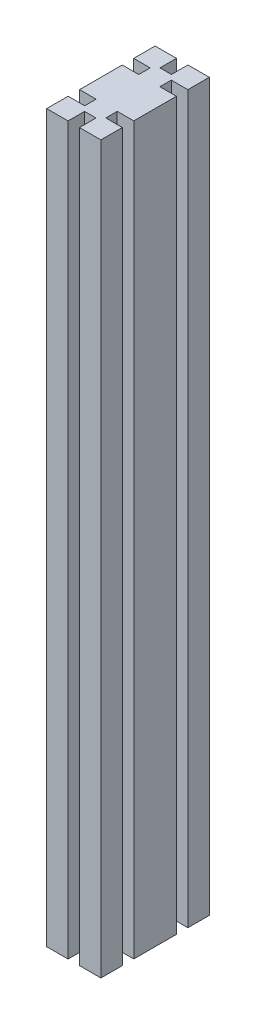
ISO-10303-21;
HEADER;
FILE_DESCRIPTION(('STEP AP214'),'2;1');
FILE_NAME('part.step','',(''),(''),'','','');
FILE_SCHEMA(('AUTOMOTIVE_DESIGN { 1 0 10303 214 1 1 1 1 }'));
ENDSEC;
DATA;
#1=APPLICATION_CONTEXT('core data for automotive mechanical design processes');
#2=APPLICATION_PROTOCOL_DEFINITION('international standard','automotive_design',2000,#1);
#3=PRODUCT_CONTEXT('',#1,'mechanical');
#4=PRODUCT('Part','Part','',(#3));
#5=PRODUCT_RELATED_PRODUCT_CATEGORY('part','',(#4));
#6=PRODUCT_DEFINITION_FORMATION('','',#4);
#7=PRODUCT_DEFINITION_CONTEXT('part definition',#1,'design');
#8=PRODUCT_DEFINITION('design','',#6,#7);
#9=PRODUCT_DEFINITION_SHAPE('','',#8);
#10=(LENGTH_UNIT() NAMED_UNIT(*) SI_UNIT(.MILLI.,.METRE.));
#11=(NAMED_UNIT(*) PLANE_ANGLE_UNIT() SI_UNIT($,.RADIAN.));
#12=(NAMED_UNIT(*) SI_UNIT($,.STERADIAN.) SOLID_ANGLE_UNIT());
#13=UNCERTAINTY_MEASURE_WITH_UNIT(LENGTH_MEASURE(1.E-05),#10,'distance_accuracy_value','');
#14=(GEOMETRIC_REPRESENTATION_CONTEXT(3) GLOBAL_UNCERTAINTY_ASSIGNED_CONTEXT((#13)) GLOBAL_UNIT_ASSIGNED_CONTEXT((#10,
#11,#12)) REPRESENTATION_CONTEXT('',''));
#15=CARTESIAN_POINT('',(0.,0.,0.));
#16=DIRECTION('',(0.,0.,1.));
#17=DIRECTION('',(1.,0.,0.));
#18=AXIS2_PLACEMENT_3D('',#15,#16,#17);
#19=CARTESIAN_POINT('',(18.95475,508.,0.));
#20=DIRECTION('',(-1.,0.,0.));
#21=DIRECTION('',(0.,0.,1.));
#22=AXIS2_PLACEMENT_3D('',#19,#20,#21);
#23=PLANE('',#22);
#24=DIRECTION('',(0.,0.,-1.));
#25=VECTOR('',#24,1.);
#26=CARTESIAN_POINT('',(18.95475,0.,0.));
#27=LINE('',#26,#25);
#28=CARTESIAN_POINT('',(18.95475,0.,37.94125));
#29=VERTEX_POINT('',#28);
#30=CARTESIAN_POINT('',(18.95475,0.,22.9362));
#31=VERTEX_POINT('',#30);
#32=EDGE_CURVE('E268',#29,#31,#27,.T.);
#33=ORIENTED_EDGE('',*,*,#32,.T.);
#34=DIRECTION('',(0.,-1.,0.));
#35=VECTOR('',#34,1.);
#36=CARTESIAN_POINT('',(18.95475,508.,22.9362));
#37=LINE('',#36,#35);
#38=CARTESIAN_POINT('',(18.95475,508.,22.9362));
#39=VERTEX_POINT('',#38);
#40=EDGE_CURVE('E11',#39,#31,#37,.T.);
#41=ORIENTED_EDGE('',*,*,#40,.F.);
#42=DIRECTION('',(0.,0.,-1.));
#43=VECTOR('',#42,1.);
#44=CARTESIAN_POINT('',(18.95475,508.,0.));
#45=LINE('',#44,#43);
#46=CARTESIAN_POINT('',(18.95475,508.,37.94125));
#47=VERTEX_POINT('',#46);
#48=EDGE_CURVE('E456',#47,#39,#45,.T.);
#49=ORIENTED_EDGE('',*,*,#48,.F.);
#50=DIRECTION('',(0.,-1.,0.));
#51=VECTOR('',#50,1.);
#52=CARTESIAN_POINT('',(18.95475,508.,37.94125));
#53=LINE('',#52,#51);
#54=EDGE_CURVE('E354',#47,#29,#53,.T.);
#55=ORIENTED_EDGE('',*,*,#54,.T.);
#56=EDGE_LOOP('',(#33,#41,#49,#55));
#57=FACE_BOUND('',#56,.T.);
#58=ADVANCED_FACE('F47',(#57),#23,.F.);
#59=CARTESIAN_POINT('',(0.,508.,22.9362));
#60=DIRECTION('',(0.,0.,1.));
#61=DIRECTION('',(1.,0.,0.));
#62=AXIS2_PLACEMENT_3D('',#59,#60,#61);
#63=PLANE('',#62);
#64=DIRECTION('',(-1.,0.,0.));
#65=VECTOR('',#64,1.);
#66=CARTESIAN_POINT('',(0.,0.,22.9362));
#67=LINE('',#66,#65);
#68=CARTESIAN_POINT('',(7.39775000000001,0.,22.9362));
#69=VERTEX_POINT('',#68);
#70=EDGE_CURVE('E272',#31,#69,#67,.T.);
#71=ORIENTED_EDGE('',*,*,#70,.T.);
#72=DIRECTION('',(0.,-1.,0.));
#73=VECTOR('',#72,1.);
#74=CARTESIAN_POINT('',(7.39775000000001,508.,22.9362));
#75=LINE('',#74,#73);
#76=CARTESIAN_POINT('',(7.39775000000001,508.,22.9362));
#77=VERTEX_POINT('',#76);
#78=EDGE_CURVE('E57',#77,#69,#75,.T.);
#79=ORIENTED_EDGE('',*,*,#78,.F.);
#80=DIRECTION('',(-1.,0.,0.));
#81=VECTOR('',#80,1.);
#82=CARTESIAN_POINT('',(0.,508.,22.9362));
#83=LINE('',#82,#81);
#84=EDGE_CURVE('E167',#39,#77,#83,.T.);
#85=ORIENTED_EDGE('',*,*,#84,.F.);
#86=ORIENTED_EDGE('',*,*,#40,.T.);
#87=EDGE_LOOP('',(#71,#79,#85,#86));
#88=FACE_BOUND('',#87,.T.);
#89=ADVANCED_FACE('F49',(#88),#63,.F.);
#90=CARTESIAN_POINT('',(7.39775000000001,508.,0.));
#91=DIRECTION('',(-1.,0.,0.));
#92=DIRECTION('',(0.,0.,1.));
#93=AXIS2_PLACEMENT_3D('',#90,#91,#92);
#94=PLANE('',#93);
#95=DIRECTION('',(0.,0.,-1.));
#96=VECTOR('',#95,1.);
#97=CARTESIAN_POINT('',(7.39775000000001,0.,0.));
#98=LINE('',#97,#96);
#99=CARTESIAN_POINT('',(7.39775000000001,0.,14.9225));
#100=VERTEX_POINT('',#99);
#101=EDGE_CURVE('E277',#69,#100,#98,.T.);
#102=ORIENTED_EDGE('',*,*,#101,.T.);
#103=DIRECTION('',(0.,-1.,0.));
#104=VECTOR('',#103,1.);
#105=CARTESIAN_POINT('',(7.39775000000001,508.,14.9225));
#106=LINE('',#105,#104);
#107=CARTESIAN_POINT('',(7.39775000000001,508.,14.9225));
#108=VERTEX_POINT('',#107);
#109=EDGE_CURVE('E427',#108,#100,#106,.T.);
#110=ORIENTED_EDGE('',*,*,#109,.F.);
#111=DIRECTION('',(0.,0.,-1.));
#112=VECTOR('',#111,1.);
#113=CARTESIAN_POINT('',(7.39775000000001,508.,0.));
#114=LINE('',#113,#112);
#115=EDGE_CURVE('E436',#77,#108,#114,.T.);
#116=ORIENTED_EDGE('',*,*,#115,.F.);
#117=ORIENTED_EDGE('',*,*,#78,.T.);
#118=EDGE_LOOP('',(#102,#110,#116,#117));
#119=FACE_BOUND('',#118,.T.);
#120=ADVANCED_FACE('F434',(#119),#94,.F.);
#121=CARTESIAN_POINT('',(0.,508.,14.9225));
#122=DIRECTION('',(0.,0.,1.));
#123=DIRECTION('',(1.,0.,0.));
#124=AXIS2_PLACEMENT_3D('',#121,#122,#123);
#125=PLANE('',#124);
#126=DIRECTION('',(-1.,0.,0.));
#127=VECTOR('',#126,1.);
#128=CARTESIAN_POINT('',(0.,0.,14.9225));
#129=LINE('',#128,#127);
#130=CARTESIAN_POINT('',(18.95475,0.,14.9225));
#131=VERTEX_POINT('',#130);
#132=EDGE_CURVE('E281',#131,#100,#129,.T.);
#133=ORIENTED_EDGE('',*,*,#132,.F.);
#134=DIRECTION('',(0.,-1.,0.));
#135=VECTOR('',#134,1.);
#136=CARTESIAN_POINT('',(18.95475,508.,14.9225));
#137=LINE('',#136,#135);
#138=CARTESIAN_POINT('',(18.95475,508.,14.9225));
#139=VERTEX_POINT('',#138);
#140=EDGE_CURVE('E424',#139,#131,#137,.T.);
#141=ORIENTED_EDGE('',*,*,#140,.F.);
#142=DIRECTION('',(-1.,0.,0.));
#143=VECTOR('',#142,1.);
#144=CARTESIAN_POINT('',(0.,508.,14.9225));
#145=LINE('',#144,#143);
#146=EDGE_CURVE('E448',#139,#108,#145,.T.);
#147=ORIENTED_EDGE('',*,*,#146,.T.);
#148=ORIENTED_EDGE('',*,*,#109,.T.);
#149=EDGE_LOOP('',(#133,#141,#147,#148));
#150=FACE_BOUND('',#149,.T.);
#151=ADVANCED_FACE('F444',(#150),#125,.T.);
#152=CARTESIAN_POINT('',(18.95475,0.,-14.9225));
#153=VERTEX_POINT('',#152);
#154=EDGE_CURVE('E274',#131,#153,#27,.T.);
#155=ORIENTED_EDGE('',*,*,#154,.T.);
#156=DIRECTION('',(0.,-1.,0.));
#157=VECTOR('',#156,1.);
#158=CARTESIAN_POINT('',(18.95475,508.,-14.9225));
#159=LINE('',#158,#157);
#160=CARTESIAN_POINT('',(18.95475,508.,-14.9225));
#161=VERTEX_POINT('',#160);
#162=EDGE_CURVE('E420',#161,#153,#159,.T.);
#163=ORIENTED_EDGE('',*,*,#162,.F.);
#164=EDGE_CURVE('E450',#139,#161,#45,.T.);
#165=ORIENTED_EDGE('',*,*,#164,.F.);
#166=ORIENTED_EDGE('',*,*,#140,.T.);
#167=EDGE_LOOP('',(#155,#163,#165,#166));
#168=FACE_BOUND('',#167,.T.);
#169=ADVANCED_FACE('F566',(#168),#23,.F.);
#170=CARTESIAN_POINT('',(0.,508.,-14.9225));
#171=DIRECTION('',(0.,0.,1.));
#172=DIRECTION('',(1.,0.,0.));
#173=AXIS2_PLACEMENT_3D('',#170,#171,#172);
#174=PLANE('',#173);
#175=DIRECTION('',(-1.,0.,0.));
#176=VECTOR('',#175,1.);
#177=CARTESIAN_POINT('',(0.,0.,-14.9225));
#178=LINE('',#177,#176);
#179=CARTESIAN_POINT('',(7.39775,0.,-14.9225));
#180=VERTEX_POINT('',#179);
#181=EDGE_CURVE('E285',#153,#180,#178,.T.);
#182=ORIENTED_EDGE('',*,*,#181,.T.);
#183=DIRECTION('',(0.,-1.,0.));
#184=VECTOR('',#183,1.);
#185=CARTESIAN_POINT('',(7.39775,508.,-14.9225));
#186=LINE('',#185,#184);
#187=CARTESIAN_POINT('',(7.39775,508.,-14.9225));
#188=VERTEX_POINT('',#187);
#189=EDGE_CURVE('E417',#188,#180,#186,.T.);
#190=ORIENTED_EDGE('',*,*,#189,.F.);
#191=DIRECTION('',(-1.,0.,0.));
#192=VECTOR('',#191,1.);
#193=CARTESIAN_POINT('',(0.,508.,-14.9225));
#194=LINE('',#193,#192);
#195=EDGE_CURVE('E454',#161,#188,#194,.T.);
#196=ORIENTED_EDGE('',*,*,#195,.F.);
#197=ORIENTED_EDGE('',*,*,#162,.T.);
#198=EDGE_LOOP('',(#182,#190,#196,#197));
#199=FACE_BOUND('',#198,.T.);
#200=ADVANCED_FACE('F574',(#199),#174,.F.);
#201=CARTESIAN_POINT('',(7.39775000000001,508.,0.));
#202=DIRECTION('',(1.,0.,0.));
#203=DIRECTION('',(0.,0.,-1.));
#204=AXIS2_PLACEMENT_3D('',#201,#202,#203);
#205=PLANE('',#204);
#206=DIRECTION('',(0.,0.,1.));
#207=VECTOR('',#206,1.);
#208=CARTESIAN_POINT('',(7.39775000000001,0.,0.));
#209=LINE('',#208,#207);
#210=CARTESIAN_POINT('',(7.39775,0.,-22.9362));
#211=VERTEX_POINT('',#210);
#212=EDGE_CURVE('E289',#211,#180,#209,.T.);
#213=ORIENTED_EDGE('',*,*,#212,.F.);
#214=DIRECTION('',(0.,-1.,0.));
#215=VECTOR('',#214,1.);
#216=CARTESIAN_POINT('',(7.39775,508.,-22.9362));
#217=LINE('',#216,#215);
#218=CARTESIAN_POINT('',(7.39775,508.,-22.9362));
#219=VERTEX_POINT('',#218);
#220=EDGE_CURVE('E414',#219,#211,#217,.T.);
#221=ORIENTED_EDGE('',*,*,#220,.F.);
#222=DIRECTION('',(0.,0.,1.));
#223=VECTOR('',#222,1.);
#224=CARTESIAN_POINT('',(7.39775000000001,508.,0.));
#225=LINE('',#224,#223);
#226=EDGE_CURVE('E463',#219,#188,#225,.T.);
#227=ORIENTED_EDGE('',*,*,#226,.T.);
#228=ORIENTED_EDGE('',*,*,#189,.T.);
#229=EDGE_LOOP('',(#213,#221,#227,#228));
#230=FACE_BOUND('',#229,.T.);
#231=ADVANCED_FACE('F588',(#230),#205,.T.);
#232=CARTESIAN_POINT('',(0.,508.,-22.9362));
#233=DIRECTION('',(0.,0.,1.));
#234=DIRECTION('',(1.,0.,0.));
#235=AXIS2_PLACEMENT_3D('',#232,#233,#234);
#236=PLANE('',#235);
#237=DIRECTION('',(-1.,0.,0.));
#238=VECTOR('',#237,1.);
#239=CARTESIAN_POINT('',(0.,0.,-22.9362));
#240=LINE('',#239,#238);
#241=CARTESIAN_POINT('',(18.95475,0.,-22.9362));
#242=VERTEX_POINT('',#241);
#243=EDGE_CURVE('E293',#242,#211,#240,.T.);
#244=ORIENTED_EDGE('',*,*,#243,.F.);
#245=DIRECTION('',(0.,-1.,0.));
#246=VECTOR('',#245,1.);
#247=CARTESIAN_POINT('',(18.95475,508.,-22.9362));
#248=LINE('',#247,#246);
#249=CARTESIAN_POINT('',(18.95475,508.,-22.9362));
#250=VERTEX_POINT('',#249);
#251=EDGE_CURVE('E411',#250,#242,#248,.T.);
#252=ORIENTED_EDGE('',*,*,#251,.F.);
#253=DIRECTION('',(-1.,0.,0.));
#254=VECTOR('',#253,1.);
#255=CARTESIAN_POINT('',(0.,508.,-22.9362));
#256=LINE('',#255,#254);
#257=EDGE_CURVE('E467',#250,#219,#256,.T.);
#258=ORIENTED_EDGE('',*,*,#257,.T.);
#259=ORIENTED_EDGE('',*,*,#220,.T.);
#260=EDGE_LOOP('',(#244,#252,#258,#259));
#261=FACE_BOUND('',#260,.T.);
#262=ADVANCED_FACE('F578',(#261),#236,.T.);
#263=CARTESIAN_POINT('',(18.95475,0.,-37.94125));
#264=VERTEX_POINT('',#263);
#265=EDGE_CURVE('E273',#242,#264,#27,.T.);
#266=ORIENTED_EDGE('',*,*,#265,.T.);
#267=DIRECTION('',(0.,-1.,0.));
#268=VECTOR('',#267,1.);
#269=CARTESIAN_POINT('',(18.95475,508.,-37.94125));
#270=LINE('',#269,#268);
#271=CARTESIAN_POINT('',(18.95475,508.,-37.94125));
#272=VERTEX_POINT('',#271);
#273=EDGE_CURVE('E408',#272,#264,#270,.T.);
#274=ORIENTED_EDGE('',*,*,#273,.F.);
#275=EDGE_CURVE('E457',#250,#272,#45,.T.);
#276=ORIENTED_EDGE('',*,*,#275,.F.);
#277=ORIENTED_EDGE('',*,*,#251,.T.);
#278=EDGE_LOOP('',(#266,#274,#276,#277));
#279=FACE_BOUND('',#278,.T.);
#280=ADVANCED_FACE('F567',(#279),#23,.F.);
#281=CARTESIAN_POINT('',(0.,508.,-37.94125));
#282=DIRECTION('',(0.,0.,-1.));
#283=DIRECTION('',(-1.,0.,0.));
#284=AXIS2_PLACEMENT_3D('',#281,#282,#283);
#285=PLANE('',#284);
#286=DIRECTION('',(1.,0.,0.));
#287=VECTOR('',#286,1.);
#288=CARTESIAN_POINT('',(0.,0.,-37.94125));
#289=LINE('',#288,#287);
#290=CARTESIAN_POINT('',(4.00685000000001,0.,-37.94125));
#291=VERTEX_POINT('',#290);
#292=EDGE_CURVE('E297',#291,#264,#289,.T.);
#293=ORIENTED_EDGE('',*,*,#292,.F.);
#294=DIRECTION('',(0.,-1.,0.));
#295=VECTOR('',#294,1.);
#296=CARTESIAN_POINT('',(4.00685000000001,508.,-37.94125));
#297=LINE('',#296,#295);
#298=CARTESIAN_POINT('',(4.00685000000001,508.,-37.94125));
#299=VERTEX_POINT('',#298);
#300=EDGE_CURVE('E405',#299,#291,#297,.T.);
#301=ORIENTED_EDGE('',*,*,#300,.F.);
#302=DIRECTION('',(1.,0.,0.));
#303=VECTOR('',#302,1.);
#304=CARTESIAN_POINT('',(0.,508.,-37.94125));
#305=LINE('',#304,#303);
#306=EDGE_CURVE('E471',#299,#272,#305,.T.);
#307=ORIENTED_EDGE('',*,*,#306,.T.);
#308=ORIENTED_EDGE('',*,*,#273,.T.);
#309=EDGE_LOOP('',(#293,#301,#307,#308));
#310=FACE_BOUND('',#309,.T.);
#311=ADVANCED_FACE('F577',(#310),#285,.T.);
#312=CARTESIAN_POINT('',(4.00684999999999,508.,0.));
#313=DIRECTION('',(-1.,0.,0.));
#314=DIRECTION('',(0.,0.,1.));
#315=AXIS2_PLACEMENT_3D('',#312,#313,#314);
#316=PLANE('',#315);
#317=DIRECTION('',(0.,0.,-1.));
#318=VECTOR('',#317,1.);
#319=CARTESIAN_POINT('',(4.00684999999999,0.,0.));
#320=LINE('',#319,#318);
#321=CARTESIAN_POINT('',(4.00685,0.,-26.38425));
#322=VERTEX_POINT('',#321);
#323=EDGE_CURVE('E301',#322,#291,#320,.T.);
#324=ORIENTED_EDGE('',*,*,#323,.F.);
#325=DIRECTION('',(0.,-1.,0.));
#326=VECTOR('',#325,1.);
#327=CARTESIAN_POINT('',(4.00685,508.,-26.38425));
#328=LINE('',#327,#326);
#329=CARTESIAN_POINT('',(4.00685,508.,-26.38425));
#330=VERTEX_POINT('',#329);
#331=EDGE_CURVE('E402',#330,#322,#328,.T.);
#332=ORIENTED_EDGE('',*,*,#331,.F.);
#333=DIRECTION('',(0.,0.,-1.));
#334=VECTOR('',#333,1.);
#335=CARTESIAN_POINT('',(4.00684999999999,508.,0.));
#336=LINE('',#335,#334);
#337=EDGE_CURVE('E475',#330,#299,#336,.T.);
#338=ORIENTED_EDGE('',*,*,#337,.T.);
#339=ORIENTED_EDGE('',*,*,#300,.T.);
#340=EDGE_LOOP('',(#324,#332,#338,#339));
#341=FACE_BOUND('',#340,.T.);
#342=ADVANCED_FACE('F584',(#341),#316,.T.);
#343=CARTESIAN_POINT('',(0.,508.,-26.38425));
#344=DIRECTION('',(0.,0.,1.));
#345=DIRECTION('',(1.,0.,0.));
#346=AXIS2_PLACEMENT_3D('',#343,#344,#345);
#347=PLANE('',#346);
#348=DIRECTION('',(-1.,0.,0.));
#349=VECTOR('',#348,1.);
#350=CARTESIAN_POINT('',(0.,0.,-26.38425));
#351=LINE('',#350,#349);
#352=CARTESIAN_POINT('',(-4.00685,0.,-26.38425));
#353=VERTEX_POINT('',#352);
#354=EDGE_CURVE('E306',#322,#353,#351,.T.);
#355=ORIENTED_EDGE('',*,*,#354,.T.);
#356=DIRECTION('',(0.,-1.,0.));
#357=VECTOR('',#356,1.);
#358=CARTESIAN_POINT('',(-4.00685,508.,-26.38425));
#359=LINE('',#358,#357);
#360=CARTESIAN_POINT('',(-4.00685,508.,-26.38425));
#361=VERTEX_POINT('',#360);
#362=EDGE_CURVE('E398',#361,#353,#359,.T.);
#363=ORIENTED_EDGE('',*,*,#362,.F.);
#364=DIRECTION('',(-1.,0.,0.));
#365=VECTOR('',#364,1.);
#366=CARTESIAN_POINT('',(0.,508.,-26.38425));
#367=LINE('',#366,#365);
#368=EDGE_CURVE('E480',#330,#361,#367,.T.);
#369=ORIENTED_EDGE('',*,*,#368,.F.);
#370=ORIENTED_EDGE('',*,*,#331,.T.);
#371=EDGE_LOOP('',(#355,#363,#369,#370));
#372=FACE_BOUND('',#371,.T.);
#373=ADVANCED_FACE('F606',(#372),#347,.F.);
#374=CARTESIAN_POINT('',(-4.00685000000001,508.,0.));
#375=DIRECTION('',(-1.,0.,0.));
#376=DIRECTION('',(0.,0.,1.));
#377=AXIS2_PLACEMENT_3D('',#374,#375,#376);
#378=PLANE('',#377);
#379=DIRECTION('',(0.,0.,-1.));
#380=VECTOR('',#379,1.);
#381=CARTESIAN_POINT('',(-4.00685000000001,0.,0.));
#382=LINE('',#381,#380);
#383=CARTESIAN_POINT('',(-4.00684999999999,0.,-37.94125));
#384=VERTEX_POINT('',#383);
#385=EDGE_CURVE('E309',#353,#384,#382,.T.);
#386=ORIENTED_EDGE('',*,*,#385,.T.);
#387=DIRECTION('',(0.,-1.,0.));
#388=VECTOR('',#387,1.);
#389=CARTESIAN_POINT('',(-4.00684999999999,508.,-37.94125));
#390=LINE('',#389,#388);
#391=CARTESIAN_POINT('',(-4.00684999999999,508.,-37.94125));
#392=VERTEX_POINT('',#391);
#393=EDGE_CURVE('E395',#392,#384,#390,.T.);
#394=ORIENTED_EDGE('',*,*,#393,.F.);
#395=DIRECTION('',(0.,0.,-1.));
#396=VECTOR('',#395,1.);
#397=CARTESIAN_POINT('',(-4.00685000000001,508.,0.));
#398=LINE('',#397,#396);
#399=EDGE_CURVE('E483',#361,#392,#398,.T.);
#400=ORIENTED_EDGE('',*,*,#399,.F.);
#401=ORIENTED_EDGE('',*,*,#362,.T.);
#402=EDGE_LOOP('',(#386,#394,#400,#401));
#403=FACE_BOUND('',#402,.T.);
#404=ADVANCED_FACE('F613',(#403),#378,.F.);
#405=CARTESIAN_POINT('',(-18.95475,0.,-37.94125));
#406=VERTEX_POINT('',#405);
#407=EDGE_CURVE('E302',#406,#384,#289,.T.);
#408=ORIENTED_EDGE('',*,*,#407,.F.);
#409=DIRECTION('',(0.,-1.,0.));
#410=VECTOR('',#409,1.);
#411=CARTESIAN_POINT('',(-18.95475,508.,-37.94125));
#412=LINE('',#411,#410);
#413=CARTESIAN_POINT('',(-18.95475,508.,-37.94125));
#414=VERTEX_POINT('',#413);
#415=EDGE_CURVE('E392',#414,#406,#412,.T.);
#416=ORIENTED_EDGE('',*,*,#415,.F.);
#417=EDGE_CURVE('E476',#414,#392,#305,.T.);
#418=ORIENTED_EDGE('',*,*,#417,.T.);
#419=ORIENTED_EDGE('',*,*,#393,.T.);
#420=EDGE_LOOP('',(#408,#416,#418,#419));
#421=FACE_BOUND('',#420,.T.);
#422=ADVANCED_FACE('F587',(#421),#285,.T.);
#423=CARTESIAN_POINT('',(-18.95475,508.,0.));
#424=DIRECTION('',(-1.,0.,0.));
#425=DIRECTION('',(0.,0.,1.));
#426=AXIS2_PLACEMENT_3D('',#423,#424,#425);
#427=PLANE('',#426);
#428=DIRECTION('',(0.,0.,-1.));
#429=VECTOR('',#428,1.);
#430=CARTESIAN_POINT('',(-18.95475,0.,0.));
#431=LINE('',#430,#429);
#432=CARTESIAN_POINT('',(-18.95475,0.,-22.9362));
#433=VERTEX_POINT('',#432);
#434=EDGE_CURVE('E313',#433,#406,#431,.T.);
#435=ORIENTED_EDGE('',*,*,#434,.F.);
#436=DIRECTION('',(0.,-1.,0.));
#437=VECTOR('',#436,1.);
#438=CARTESIAN_POINT('',(-18.95475,508.,-22.9362));
#439=LINE('',#438,#437);
#440=CARTESIAN_POINT('',(-18.95475,508.,-22.9362));
#441=VERTEX_POINT('',#440);
#442=EDGE_CURVE('E389',#441,#433,#439,.T.);
#443=ORIENTED_EDGE('',*,*,#442,.F.);
#444=DIRECTION('',(0.,0.,-1.));
#445=VECTOR('',#444,1.);
#446=CARTESIAN_POINT('',(-18.95475,508.,0.));
#447=LINE('',#446,#445);
#448=EDGE_CURVE('E486',#441,#414,#447,.T.);
#449=ORIENTED_EDGE('',*,*,#448,.T.);
#450=ORIENTED_EDGE('',*,*,#415,.T.);
#451=EDGE_LOOP('',(#435,#443,#449,#450));
#452=FACE_BOUND('',#451,.T.);
#453=ADVANCED_FACE('F561',(#452),#427,.T.);
#454=CARTESIAN_POINT('',(0.,508.,-22.9362));
#455=DIRECTION('',(0.,0.,-1.));
#456=DIRECTION('',(-1.,0.,0.));
#457=AXIS2_PLACEMENT_3D('',#454,#455,#456);
#458=PLANE('',#457);
#459=DIRECTION('',(1.,0.,0.));
#460=VECTOR('',#459,1.);
#461=CARTESIAN_POINT('',(0.,0.,-22.9362));
#462=LINE('',#461,#460);
#463=CARTESIAN_POINT('',(-7.39774999999999,0.,-22.9362));
#464=VERTEX_POINT('',#463);
#465=EDGE_CURVE('E317',#433,#464,#462,.T.);
#466=ORIENTED_EDGE('',*,*,#465,.T.);
#467=DIRECTION('',(0.,-1.,0.));
#468=VECTOR('',#467,1.);
#469=CARTESIAN_POINT('',(-7.39774999999999,508.,-22.9362));
#470=LINE('',#469,#468);
#471=CARTESIAN_POINT('',(-7.39774999999999,508.,-22.9362));
#472=VERTEX_POINT('',#471);
#473=EDGE_CURVE('E385',#472,#464,#470,.T.);
#474=ORIENTED_EDGE('',*,*,#473,.F.);
#475=DIRECTION('',(1.,0.,0.));
#476=VECTOR('',#475,1.);
#477=CARTESIAN_POINT('',(0.,508.,-22.9362));
#478=LINE('',#477,#476);
#479=EDGE_CURVE('E490',#441,#472,#478,.T.);
#480=ORIENTED_EDGE('',*,*,#479,.F.);
#481=ORIENTED_EDGE('',*,*,#442,.T.);
#482=EDGE_LOOP('',(#466,#474,#480,#481));
#483=FACE_BOUND('',#482,.T.);
#484=ADVANCED_FACE('F728',(#483),#458,.F.);
#485=CARTESIAN_POINT('',(-7.39775,508.,0.));
#486=DIRECTION('',(1.,0.,0.));
#487=DIRECTION('',(0.,0.,-1.));
#488=AXIS2_PLACEMENT_3D('',#485,#486,#487);
#489=PLANE('',#488);
#490=DIRECTION('',(0.,0.,1.));
#491=VECTOR('',#490,1.);
#492=CARTESIAN_POINT('',(-7.39775,0.,0.));
#493=LINE('',#492,#491);
#494=CARTESIAN_POINT('',(-7.39775,0.,-14.9225));
#495=VERTEX_POINT('',#494);
#496=EDGE_CURVE('E322',#464,#495,#493,.T.);
#497=ORIENTED_EDGE('',*,*,#496,.T.);
#498=DIRECTION('',(0.,-1.,0.));
#499=VECTOR('',#498,1.);
#500=CARTESIAN_POINT('',(-7.39775,508.,-14.9225));
#501=LINE('',#500,#499);
#502=CARTESIAN_POINT('',(-7.39775,508.,-14.9225));
#503=VERTEX_POINT('',#502);
#504=EDGE_CURVE('E382',#503,#495,#501,.T.);
#505=ORIENTED_EDGE('',*,*,#504,.F.);
#506=DIRECTION('',(0.,0.,1.));
#507=VECTOR('',#506,1.);
#508=CARTESIAN_POINT('',(-7.39775,508.,0.));
#509=LINE('',#508,#507);
#510=EDGE_CURVE('E495',#472,#503,#509,.T.);
#511=ORIENTED_EDGE('',*,*,#510,.F.);
#512=ORIENTED_EDGE('',*,*,#473,.T.);
#513=EDGE_LOOP('',(#497,#505,#511,#512));
#514=FACE_BOUND('',#513,.T.);
#515=ADVANCED_FACE('F721',(#514),#489,.F.);
#516=CARTESIAN_POINT('',(0.,508.,-14.9225));
#517=DIRECTION('',(0.,0.,-1.));
#518=DIRECTION('',(-1.,0.,0.));
#519=AXIS2_PLACEMENT_3D('',#516,#517,#518);
#520=PLANE('',#519);
#521=DIRECTION('',(1.,0.,0.));
#522=VECTOR('',#521,1.);
#523=CARTESIAN_POINT('',(0.,0.,-14.9225));
#524=LINE('',#523,#522);
#525=CARTESIAN_POINT('',(-18.95475,0.,-14.9225));
#526=VERTEX_POINT('',#525);
#527=EDGE_CURVE('E326',#526,#495,#524,.T.);
#528=ORIENTED_EDGE('',*,*,#527,.F.);
#529=DIRECTION('',(0.,-1.,0.));
#530=VECTOR('',#529,1.);
#531=CARTESIAN_POINT('',(-18.95475,508.,-14.9225));
#532=LINE('',#531,#530);
#533=CARTESIAN_POINT('',(-18.95475,508.,-14.9225));
#534=VERTEX_POINT('',#533);
#535=EDGE_CURVE('E379',#534,#526,#532,.T.);
#536=ORIENTED_EDGE('',*,*,#535,.F.);
#537=DIRECTION('',(1.,0.,0.));
#538=VECTOR('',#537,1.);
#539=CARTESIAN_POINT('',(0.,508.,-14.9225));
#540=LINE('',#539,#538);
#541=EDGE_CURVE('E498',#534,#503,#540,.T.);
#542=ORIENTED_EDGE('',*,*,#541,.T.);
#543=ORIENTED_EDGE('',*,*,#504,.T.);
#544=EDGE_LOOP('',(#528,#536,#542,#543));
#545=FACE_BOUND('',#544,.T.);
#546=ADVANCED_FACE('F534',(#545),#520,.T.);
#547=CARTESIAN_POINT('',(-18.95475,0.,14.9225));
#548=VERTEX_POINT('',#547);
#549=EDGE_CURVE('E319',#548,#526,#431,.T.);
#550=ORIENTED_EDGE('',*,*,#549,.F.);
#551=DIRECTION('',(0.,-1.,0.));
#552=VECTOR('',#551,1.);
#553=CARTESIAN_POINT('',(-18.95475,508.,14.9225));
#554=LINE('',#553,#552);
#555=CARTESIAN_POINT('',(-18.95475,508.,14.9225));
#556=VERTEX_POINT('',#555);
#557=EDGE_CURVE('E376',#556,#548,#554,.T.);
#558=ORIENTED_EDGE('',*,*,#557,.F.);
#559=EDGE_CURVE('E492',#556,#534,#447,.T.);
#560=ORIENTED_EDGE('',*,*,#559,.T.);
#561=ORIENTED_EDGE('',*,*,#535,.T.);
#562=EDGE_LOOP('',(#550,#558,#560,#561));
#563=FACE_BOUND('',#562,.T.);
#564=ADVANCED_FACE('F525',(#563),#427,.T.);
#565=CARTESIAN_POINT('',(0.,508.,14.9225));
#566=DIRECTION('',(0.,0.,-1.));
#567=DIRECTION('',(-1.,0.,0.));
#568=AXIS2_PLACEMENT_3D('',#565,#566,#567);
#569=PLANE('',#568);
#570=DIRECTION('',(1.,0.,0.));
#571=VECTOR('',#570,1.);
#572=CARTESIAN_POINT('',(0.,0.,14.9225));
#573=LINE('',#572,#571);
#574=CARTESIAN_POINT('',(-7.39775,0.,14.9225));
#575=VERTEX_POINT('',#574);
#576=EDGE_CURVE('E330',#548,#575,#573,.T.);
#577=ORIENTED_EDGE('',*,*,#576,.T.);
#578=DIRECTION('',(0.,-1.,0.));
#579=VECTOR('',#578,1.);
#580=CARTESIAN_POINT('',(-7.39775,508.,14.9225));
#581=LINE('',#580,#579);
#582=CARTESIAN_POINT('',(-7.39775,508.,14.9225));
#583=VERTEX_POINT('',#582);
#584=EDGE_CURVE('E373',#583,#575,#581,.T.);
#585=ORIENTED_EDGE('',*,*,#584,.F.);
#586=DIRECTION('',(1.,0.,0.));
#587=VECTOR('',#586,1.);
#588=CARTESIAN_POINT('',(0.,508.,14.9225));
#589=LINE('',#588,#587);
#590=EDGE_CURVE('E502',#556,#583,#589,.T.);
#591=ORIENTED_EDGE('',*,*,#590,.F.);
#592=ORIENTED_EDGE('',*,*,#557,.T.);
#593=EDGE_LOOP('',(#577,#585,#591,#592));
#594=FACE_BOUND('',#593,.T.);
#595=ADVANCED_FACE('F552',(#594),#569,.F.);
#596=CARTESIAN_POINT('',(-7.39775,508.,0.));
#597=DIRECTION('',(-1.,0.,0.));
#598=DIRECTION('',(0.,0.,1.));
#599=AXIS2_PLACEMENT_3D('',#596,#597,#598);
#600=PLANE('',#599);
#601=DIRECTION('',(0.,0.,-1.));
#602=VECTOR('',#601,1.);
#603=CARTESIAN_POINT('',(-7.39775,0.,0.));
#604=LINE('',#603,#602);
#605=CARTESIAN_POINT('',(-7.39775,0.,22.9362));
#606=VERTEX_POINT('',#605);
#607=EDGE_CURVE('E334',#606,#575,#604,.T.);
#608=ORIENTED_EDGE('',*,*,#607,.F.);
#609=DIRECTION('',(0.,-1.,0.));
#610=VECTOR('',#609,1.);
#611=CARTESIAN_POINT('',(-7.39775,508.,22.9362));
#612=LINE('',#611,#610);
#613=CARTESIAN_POINT('',(-7.39775,508.,22.9362));
#614=VERTEX_POINT('',#613);
#615=EDGE_CURVE('E370',#614,#606,#612,.T.);
#616=ORIENTED_EDGE('',*,*,#615,.F.);
#617=DIRECTION('',(0.,0.,-1.));
#618=VECTOR('',#617,1.);
#619=CARTESIAN_POINT('',(-7.39775,508.,0.));
#620=LINE('',#619,#618);
#621=EDGE_CURVE('E505',#614,#583,#620,.T.);
#622=ORIENTED_EDGE('',*,*,#621,.T.);
#623=ORIENTED_EDGE('',*,*,#584,.T.);
#624=EDGE_LOOP('',(#608,#616,#622,#623));
#625=FACE_BOUND('',#624,.T.);
#626=ADVANCED_FACE('F550',(#625),#600,.T.);
#627=CARTESIAN_POINT('',(0.,508.,22.9362));
#628=DIRECTION('',(0.,0.,-1.));
#629=DIRECTION('',(-1.,0.,0.));
#630=AXIS2_PLACEMENT_3D('',#627,#628,#629);
#631=PLANE('',#630);
#632=DIRECTION('',(1.,0.,0.));
#633=VECTOR('',#632,1.);
#634=CARTESIAN_POINT('',(0.,0.,22.9362));
#635=LINE('',#634,#633);
#636=CARTESIAN_POINT('',(-18.95475,0.,22.9362));
#637=VERTEX_POINT('',#636);
#638=EDGE_CURVE('E338',#637,#606,#635,.T.);
#639=ORIENTED_EDGE('',*,*,#638,.F.);
#640=DIRECTION('',(0.,-1.,0.));
#641=VECTOR('',#640,1.);
#642=CARTESIAN_POINT('',(-18.95475,508.,22.9362));
#643=LINE('',#642,#641);
#644=CARTESIAN_POINT('',(-18.95475,508.,22.9362));
#645=VERTEX_POINT('',#644);
#646=EDGE_CURVE('E367',#645,#637,#643,.T.);
#647=ORIENTED_EDGE('',*,*,#646,.F.);
#648=DIRECTION('',(1.,0.,0.));
#649=VECTOR('',#648,1.);
#650=CARTESIAN_POINT('',(0.,508.,22.9362));
#651=LINE('',#650,#649);
#652=EDGE_CURVE('E509',#645,#614,#651,.T.);
#653=ORIENTED_EDGE('',*,*,#652,.T.);
#654=ORIENTED_EDGE('',*,*,#615,.T.);
#655=EDGE_LOOP('',(#639,#647,#653,#654));
#656=FACE_BOUND('',#655,.T.);
#657=ADVANCED_FACE('F547',(#656),#631,.T.);
#658=CARTESIAN_POINT('',(-18.95475,0.,37.94125));
#659=VERTEX_POINT('',#658);
#660=EDGE_CURVE('E318',#659,#637,#431,.T.);
#661=ORIENTED_EDGE('',*,*,#660,.F.);
#662=DIRECTION('',(0.,-1.,0.));
#663=VECTOR('',#662,1.);
#664=CARTESIAN_POINT('',(-18.95475,508.,37.94125));
#665=LINE('',#664,#663);
#666=CARTESIAN_POINT('',(-18.95475,508.,37.94125));
#667=VERTEX_POINT('',#666);
#668=EDGE_CURVE('E364',#667,#659,#665,.T.);
#669=ORIENTED_EDGE('',*,*,#668,.F.);
#670=EDGE_CURVE('E491',#667,#645,#447,.T.);
#671=ORIENTED_EDGE('',*,*,#670,.T.);
#672=ORIENTED_EDGE('',*,*,#646,.T.);
#673=EDGE_LOOP('',(#661,#669,#671,#672));
#674=FACE_BOUND('',#673,.T.);
#675=ADVANCED_FACE('F544',(#674),#427,.T.);
#676=CARTESIAN_POINT('',(0.,508.,37.94125));
#677=DIRECTION('',(0.,0.,-1.));
#678=DIRECTION('',(-1.,0.,0.));
#679=AXIS2_PLACEMENT_3D('',#676,#677,#678);
#680=PLANE('',#679);
#681=DIRECTION('',(1.,0.,0.));
#682=VECTOR('',#681,1.);
#683=CARTESIAN_POINT('',(0.,0.,37.94125));
#684=LINE('',#683,#682);
#685=CARTESIAN_POINT('',(-4.00685,0.,37.94125));
#686=VERTEX_POINT('',#685);
#687=EDGE_CURVE('E342',#659,#686,#684,.T.);
#688=ORIENTED_EDGE('',*,*,#687,.T.);
#689=DIRECTION('',(0.,-1.,0.));
#690=VECTOR('',#689,1.);
#691=CARTESIAN_POINT('',(-4.00685,508.,37.94125));
#692=LINE('',#691,#690);
#693=CARTESIAN_POINT('',(-4.00685,508.,37.94125));
#694=VERTEX_POINT('',#693);
#695=EDGE_CURVE('E361',#694,#686,#692,.T.);
#696=ORIENTED_EDGE('',*,*,#695,.F.);
#697=DIRECTION('',(1.,0.,0.));
#698=VECTOR('',#697,1.);
#699=CARTESIAN_POINT('',(0.,508.,37.94125));
#700=LINE('',#699,#698);
#701=EDGE_CURVE('E264',#667,#694,#700,.T.);
#702=ORIENTED_EDGE('',*,*,#701,.F.);
#703=ORIENTED_EDGE('',*,*,#668,.T.);
#704=EDGE_LOOP('',(#688,#696,#702,#703));
#705=FACE_BOUND('',#704,.T.);
#706=ADVANCED_FACE('F629',(#705),#680,.F.);
#707=CARTESIAN_POINT('',(-4.00685000000001,508.,0.));
#708=DIRECTION('',(1.,0.,0.));
#709=DIRECTION('',(0.,0.,-1.));
#710=AXIS2_PLACEMENT_3D('',#707,#708,#709);
#711=PLANE('',#710);
#712=DIRECTION('',(0.,0.,1.));
#713=VECTOR('',#712,1.);
#714=CARTESIAN_POINT('',(-4.00685000000001,0.,0.));
#715=LINE('',#714,#713);
#716=CARTESIAN_POINT('',(-4.00685,0.,26.38425));
#717=VERTEX_POINT('',#716);
#718=EDGE_CURVE('E346',#717,#686,#715,.T.);
#719=ORIENTED_EDGE('',*,*,#718,.F.);
#720=DIRECTION('',(0.,-1.,0.));
#721=VECTOR('',#720,1.);
#722=CARTESIAN_POINT('',(-4.00685,508.,26.38425));
#723=LINE('',#722,#721);
#724=CARTESIAN_POINT('',(-4.00685,508.,26.38425));
#725=VERTEX_POINT('',#724);
#726=EDGE_CURVE('E250',#725,#717,#723,.T.);
#727=ORIENTED_EDGE('',*,*,#726,.F.);
#728=DIRECTION('',(0.,0.,1.));
#729=VECTOR('',#728,1.);
#730=CARTESIAN_POINT('',(-4.00685000000001,508.,0.));
#731=LINE('',#730,#729);
#732=EDGE_CURVE('E260',#725,#694,#731,.T.);
#733=ORIENTED_EDGE('',*,*,#732,.T.);
#734=ORIENTED_EDGE('',*,*,#695,.T.);
#735=EDGE_LOOP('',(#719,#727,#733,#734));
#736=FACE_BOUND('',#735,.T.);
#737=ADVANCED_FACE('F627',(#736),#711,.T.);
#738=CARTESIAN_POINT('',(0.,508.,26.38425));
#739=DIRECTION('',(0.,0.,1.));
#740=DIRECTION('',(1.,0.,0.));
#741=AXIS2_PLACEMENT_3D('',#738,#739,#740);
#742=PLANE('',#741);
#743=DIRECTION('',(-1.,0.,0.));
#744=VECTOR('',#743,1.);
#745=CARTESIAN_POINT('',(0.,0.,26.38425));
#746=LINE('',#745,#744);
#747=CARTESIAN_POINT('',(4.00685,0.,26.38425));
#748=VERTEX_POINT('',#747);
#749=EDGE_CURVE('E248',#748,#717,#746,.T.);
#750=ORIENTED_EDGE('',*,*,#749,.F.);
#751=DIRECTION('',(0.,-1.,0.));
#752=VECTOR('',#751,1.);
#753=CARTESIAN_POINT('',(4.00685,508.,26.38425));
#754=LINE('',#753,#752);
#755=CARTESIAN_POINT('',(4.00685,508.,26.38425));
#756=VERTEX_POINT('',#755);
#757=EDGE_CURVE('E242',#756,#748,#754,.T.);
#758=ORIENTED_EDGE('',*,*,#757,.F.);
#759=DIRECTION('',(-1.,0.,0.));
#760=VECTOR('',#759,1.);
#761=CARTESIAN_POINT('',(0.,508.,26.38425));
#762=LINE('',#761,#760);
#763=EDGE_CURVE('E246',#756,#725,#762,.T.);
#764=ORIENTED_EDGE('',*,*,#763,.T.);
#765=ORIENTED_EDGE('',*,*,#726,.T.);
#766=EDGE_LOOP('',(#750,#758,#764,#765));
#767=FACE_BOUND('',#766,.T.);
#768=ADVANCED_FACE('F244',(#767),#742,.T.);
#769=CARTESIAN_POINT('',(4.00684999999999,508.,0.));
#770=DIRECTION('',(1.,0.,0.));
#771=DIRECTION('',(0.,0.,-1.));
#772=AXIS2_PLACEMENT_3D('',#769,#770,#771);
#773=PLANE('',#772);
#774=DIRECTION('',(0.,0.,1.));
#775=VECTOR('',#774,1.);
#776=CARTESIAN_POINT('',(4.00684999999999,0.,0.));
#777=LINE('',#776,#775);
#778=CARTESIAN_POINT('',(4.00685,0.,37.94125));
#779=VERTEX_POINT('',#778);
#780=EDGE_CURVE('E153',#748,#779,#777,.T.);
#781=ORIENTED_EDGE('',*,*,#780,.T.);
#782=DIRECTION('',(0.,-1.,0.));
#783=VECTOR('',#782,1.);
#784=CARTESIAN_POINT('',(4.00685,508.,37.94125));
#785=LINE('',#784,#783);
#786=CARTESIAN_POINT('',(4.00685,508.,37.94125));
#787=VERTEX_POINT('',#786);
#788=EDGE_CURVE('E251',#787,#779,#785,.T.);
#789=ORIENTED_EDGE('',*,*,#788,.F.);
#790=DIRECTION('',(0.,0.,1.));
#791=VECTOR('',#790,1.);
#792=CARTESIAN_POINT('',(4.00684999999999,508.,0.));
#793=LINE('',#792,#791);
#794=EDGE_CURVE('E253',#756,#787,#793,.T.);
#795=ORIENTED_EDGE('',*,*,#794,.F.);
#796=ORIENTED_EDGE('',*,*,#757,.T.);
#797=EDGE_LOOP('',(#781,#789,#795,#796));
#798=FACE_BOUND('',#797,.T.);
#799=ADVANCED_FACE('F254',(#798),#773,.F.);
#800=EDGE_CURVE('E159',#779,#29,#684,.T.);
#801=ORIENTED_EDGE('',*,*,#800,.T.);
#802=ORIENTED_EDGE('',*,*,#54,.F.);
#803=EDGE_CURVE('E65',#787,#47,#700,.T.);
#804=ORIENTED_EDGE('',*,*,#803,.F.);
#805=ORIENTED_EDGE('',*,*,#788,.T.);
#806=EDGE_LOOP('',(#801,#802,#804,#805));
#807=FACE_BOUND('',#806,.T.);
#808=ADVANCED_FACE('F632',(#807),#680,.F.);
#809=CARTESIAN_POINT('',(0.,508.,0.));
#810=DIRECTION('',(0.,1.,0.));
#811=DIRECTION('',(0.,0.,1.));
#812=AXIS2_PLACEMENT_3D('',#809,#810,#811);
#813=PLANE('',#812);
#814=ORIENTED_EDGE('',*,*,#48,.T.);
#815=ORIENTED_EDGE('',*,*,#84,.T.);
#816=ORIENTED_EDGE('',*,*,#115,.T.);
#817=ORIENTED_EDGE('',*,*,#146,.F.);
#818=ORIENTED_EDGE('',*,*,#164,.T.);
#819=ORIENTED_EDGE('',*,*,#195,.T.);
#820=ORIENTED_EDGE('',*,*,#226,.F.);
#821=ORIENTED_EDGE('',*,*,#257,.F.);
#822=ORIENTED_EDGE('',*,*,#275,.T.);
#823=ORIENTED_EDGE('',*,*,#306,.F.);
#824=ORIENTED_EDGE('',*,*,#337,.F.);
#825=ORIENTED_EDGE('',*,*,#368,.T.);
#826=ORIENTED_EDGE('',*,*,#399,.T.);
#827=ORIENTED_EDGE('',*,*,#417,.F.);
#828=ORIENTED_EDGE('',*,*,#448,.F.);
#829=ORIENTED_EDGE('',*,*,#479,.T.);
#830=ORIENTED_EDGE('',*,*,#510,.T.);
#831=ORIENTED_EDGE('',*,*,#541,.F.);
#832=ORIENTED_EDGE('',*,*,#559,.F.);
#833=ORIENTED_EDGE('',*,*,#590,.T.);
#834=ORIENTED_EDGE('',*,*,#621,.F.);
#835=ORIENTED_EDGE('',*,*,#652,.F.);
#836=ORIENTED_EDGE('',*,*,#670,.F.);
#837=ORIENTED_EDGE('',*,*,#701,.T.);
#838=ORIENTED_EDGE('',*,*,#732,.F.);
#839=ORIENTED_EDGE('',*,*,#763,.F.);
#840=ORIENTED_EDGE('',*,*,#794,.T.);
#841=ORIENTED_EDGE('',*,*,#803,.T.);
#842=EDGE_LOOP('',(#814,#815,#816,#817,#818,#819,#820,#821,#822,#823,#824,#825,#826,#827,#828,
#829,#830,#831,#832,#833,#834,#835,#836,#837,#838,#839,#840,#841));
#843=FACE_BOUND('',#842,.T.);
#844=ADVANCED_FACE('F258',(#843),#813,.T.);
#845=CARTESIAN_POINT('',(0.,0.,0.));
#846=DIRECTION('',(0.,1.,0.));
#847=DIRECTION('',(0.,0.,1.));
#848=AXIS2_PLACEMENT_3D('',#845,#846,#847);
#849=PLANE('',#848);
#850=ORIENTED_EDGE('',*,*,#32,.F.);
#851=ORIENTED_EDGE('',*,*,#800,.F.);
#852=ORIENTED_EDGE('',*,*,#780,.F.);
#853=ORIENTED_EDGE('',*,*,#749,.T.);
#854=ORIENTED_EDGE('',*,*,#718,.T.);
#855=ORIENTED_EDGE('',*,*,#687,.F.);
#856=ORIENTED_EDGE('',*,*,#660,.T.);
#857=ORIENTED_EDGE('',*,*,#638,.T.);
#858=ORIENTED_EDGE('',*,*,#607,.T.);
#859=ORIENTED_EDGE('',*,*,#576,.F.);
#860=ORIENTED_EDGE('',*,*,#549,.T.);
#861=ORIENTED_EDGE('',*,*,#527,.T.);
#862=ORIENTED_EDGE('',*,*,#496,.F.);
#863=ORIENTED_EDGE('',*,*,#465,.F.);
#864=ORIENTED_EDGE('',*,*,#434,.T.);
#865=ORIENTED_EDGE('',*,*,#407,.T.);
#866=ORIENTED_EDGE('',*,*,#385,.F.);
#867=ORIENTED_EDGE('',*,*,#354,.F.);
#868=ORIENTED_EDGE('',*,*,#323,.T.);
#869=ORIENTED_EDGE('',*,*,#292,.T.);
#870=ORIENTED_EDGE('',*,*,#265,.F.);
#871=ORIENTED_EDGE('',*,*,#243,.T.);
#872=ORIENTED_EDGE('',*,*,#212,.T.);
#873=ORIENTED_EDGE('',*,*,#181,.F.);
#874=ORIENTED_EDGE('',*,*,#154,.F.);
#875=ORIENTED_EDGE('',*,*,#132,.T.);
#876=ORIENTED_EDGE('',*,*,#101,.F.);
#877=ORIENTED_EDGE('',*,*,#70,.F.);
#878=EDGE_LOOP('',(#850,#851,#852,#853,#854,#855,#856,#857,#858,#859,#860,#861,#862,#863,#864,
#865,#866,#867,#868,#869,#870,#871,#872,#873,#874,#875,#876,#877));
#879=FACE_BOUND('',#878,.T.);
#880=ADVANCED_FACE('F439',(#879),#849,.F.);
#881=CLOSED_SHELL('',(#58,#89,#120,#151,#169,#200,#231,#262,#280,#311,#342,#373,#404,#422,#453,
#484,#515,#546,#564,#595,#626,#657,#675,#706,#737,#768,#799,#808,#844,#880));
#882=MANIFOLD_SOLID_BREP('B2',#881);
#883=ADVANCED_BREP_SHAPE_REPRESENTATION('',(#18,#882),#14);
#884=SHAPE_DEFINITION_REPRESENTATION(#9,#883);
ENDSEC;
END-ISO-10303-21;
